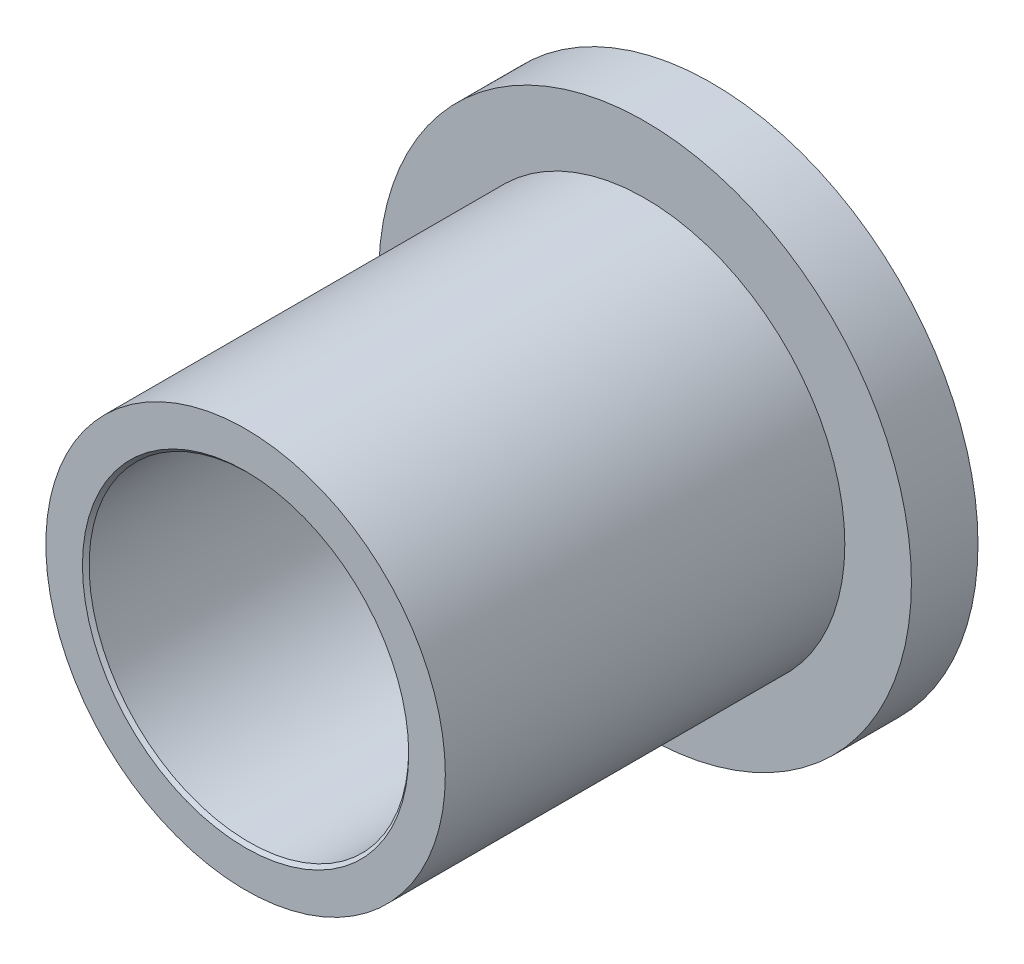
ISO-10303-21;
HEADER;
FILE_DESCRIPTION(('STEP AP214'),'2;1');
FILE_NAME('part.step','',(''),(''),'','','');
FILE_SCHEMA(('AUTOMOTIVE_DESIGN { 1 0 10303 214 1 1 1 1 }'));
ENDSEC;
DATA;
#1=APPLICATION_CONTEXT('core data for automotive mechanical design processes');
#2=APPLICATION_PROTOCOL_DEFINITION('international standard','automotive_design',2000,#1);
#3=PRODUCT_CONTEXT('',#1,'mechanical');
#4=PRODUCT('Part','Part','',(#3));
#5=PRODUCT_RELATED_PRODUCT_CATEGORY('part','',(#4));
#6=PRODUCT_DEFINITION_FORMATION('','',#4);
#7=PRODUCT_DEFINITION_CONTEXT('part definition',#1,'design');
#8=PRODUCT_DEFINITION('design','',#6,#7);
#9=PRODUCT_DEFINITION_SHAPE('','',#8);
#10=(LENGTH_UNIT() NAMED_UNIT(*) SI_UNIT(.MILLI.,.METRE.));
#11=(NAMED_UNIT(*) PLANE_ANGLE_UNIT() SI_UNIT($,.RADIAN.));
#12=(NAMED_UNIT(*) SI_UNIT($,.STERADIAN.) SOLID_ANGLE_UNIT());
#13=UNCERTAINTY_MEASURE_WITH_UNIT(LENGTH_MEASURE(1.E-05),#10,'distance_accuracy_value','');
#14=(GEOMETRIC_REPRESENTATION_CONTEXT(3) GLOBAL_UNCERTAINTY_ASSIGNED_CONTEXT((#13)) GLOBAL_UNIT_ASSIGNED_CONTEXT((#10,
#11,#12)) REPRESENTATION_CONTEXT('',''));
#15=CARTESIAN_POINT('',(0.,0.,0.));
#16=DIRECTION('',(0.,0.,1.));
#17=DIRECTION('',(1.,0.,0.));
#18=AXIS2_PLACEMENT_3D('',#15,#16,#17);
#19=CARTESIAN_POINT('',(0.,0.,0.5));
#20=DIRECTION('',(0.,0.,-1.));
#21=DIRECTION('',(-1.,0.,0.));
#22=AXIS2_PLACEMENT_3D('',#19,#20,#21);
#23=CYLINDRICAL_SURFACE('',#22,2.);
#24=CARTESIAN_POINT('',(0.,0.,0.5));
#25=DIRECTION('',(0.,0.,1.));
#26=DIRECTION('',(1.,0.,0.));
#27=AXIS2_PLACEMENT_3D('',#24,#25,#26);
#28=CIRCLE('',#27,2.);
#29=CARTESIAN_POINT('',(2.,0.,0.5));
#30=VERTEX_POINT('',#29);
#31=EDGE_CURVE('E42',#30,#30,#28,.T.);
#32=ORIENTED_EDGE('',*,*,#31,.F.);
#33=EDGE_LOOP('',(#32));
#34=FACE_BOUND('',#33,.T.);
#35=CARTESIAN_POINT('',(0.,0.,0.));
#36=DIRECTION('',(0.,0.,1.));
#37=DIRECTION('',(1.,0.,0.));
#38=AXIS2_PLACEMENT_3D('',#35,#36,#37);
#39=CIRCLE('',#38,2.);
#40=CARTESIAN_POINT('',(2.,0.,0.));
#41=VERTEX_POINT('',#40);
#42=EDGE_CURVE('E38',#41,#41,#39,.T.);
#43=ORIENTED_EDGE('',*,*,#42,.T.);
#44=EDGE_LOOP('',(#43));
#45=FACE_BOUND('',#44,.T.);
#46=ADVANCED_FACE('F35',(#34,#45),#23,.T.);
#47=CARTESIAN_POINT('',(0.,0.,0.5));
#48=DIRECTION('',(0.,0.,1.));
#49=DIRECTION('',(1.,0.,0.));
#50=AXIS2_PLACEMENT_3D('',#47,#48,#49);
#51=PLANE('',#50);
#52=CARTESIAN_POINT('',(0.,0.,0.5));
#53=DIRECTION('',(0.,0.,1.));
#54=DIRECTION('',(1.,0.,0.));
#55=AXIS2_PLACEMENT_3D('',#52,#53,#54);
#56=CIRCLE('',#55,1.5);
#57=CARTESIAN_POINT('',(1.5,0.,0.5));
#58=VERTEX_POINT('',#57);
#59=EDGE_CURVE('E10',#58,#58,#56,.T.);
#60=ORIENTED_EDGE('',*,*,#59,.F.);
#61=EDGE_LOOP('',(#60));
#62=FACE_BOUND('',#61,.T.);
#63=ORIENTED_EDGE('',*,*,#31,.T.);
#64=EDGE_LOOP('',(#63));
#65=FACE_BOUND('',#64,.T.);
#66=ADVANCED_FACE('F77',(#62,#65),#51,.T.);
#67=CARTESIAN_POINT('',(0.,0.,0.));
#68=DIRECTION('',(0.,0.,1.));
#69=DIRECTION('',(1.,0.,0.));
#70=AXIS2_PLACEMENT_3D('',#67,#68,#69);
#71=PLANE('',#70);
#72=CARTESIAN_POINT('',(0.,0.,0.));
#73=DIRECTION('',(0.,0.,1.));
#74=DIRECTION('',(1.,0.,0.));
#75=AXIS2_PLACEMENT_3D('',#72,#73,#74);
#76=CIRCLE('',#75,1.2);
#77=CARTESIAN_POINT('',(1.2,0.,0.));
#78=VERTEX_POINT('',#77);
#79=EDGE_CURVE('E51',#78,#78,#76,.T.);
#80=ORIENTED_EDGE('',*,*,#79,.T.);
#81=EDGE_LOOP('',(#80));
#82=FACE_BOUND('',#81,.T.);
#83=ORIENTED_EDGE('',*,*,#42,.F.);
#84=EDGE_LOOP('',(#83));
#85=FACE_BOUND('',#84,.T.);
#86=ADVANCED_FACE('F72',(#82,#85),#71,.F.);
#87=CARTESIAN_POINT('',(0.,0.,3.5));
#88=DIRECTION('',(0.,0.,-1.));
#89=DIRECTION('',(-1.,0.,0.));
#90=AXIS2_PLACEMENT_3D('',#87,#88,#89);
#91=CYLINDRICAL_SURFACE('',#90,1.5);
#92=CARTESIAN_POINT('',(0.,0.,3.5));
#93=DIRECTION('',(0.,0.,1.));
#94=DIRECTION('',(1.,0.,0.));
#95=AXIS2_PLACEMENT_3D('',#92,#93,#94);
#96=CIRCLE('',#95,1.5);
#97=CARTESIAN_POINT('',(1.5,0.,3.5));
#98=VERTEX_POINT('',#97);
#99=EDGE_CURVE('E48',#98,#98,#96,.T.);
#100=ORIENTED_EDGE('',*,*,#99,.F.);
#101=EDGE_LOOP('',(#100));
#102=FACE_BOUND('',#101,.T.);
#103=ORIENTED_EDGE('',*,*,#59,.T.);
#104=EDGE_LOOP('',(#103));
#105=FACE_BOUND('',#104,.T.);
#106=ADVANCED_FACE('F67',(#102,#105),#91,.T.);
#107=CARTESIAN_POINT('',(0.,0.,3.5));
#108=DIRECTION('',(0.,0.,1.));
#109=DIRECTION('',(1.,0.,0.));
#110=AXIS2_PLACEMENT_3D('',#107,#108,#109);
#111=PLANE('',#110);
#112=CARTESIAN_POINT('',(0.,0.,3.5));
#113=DIRECTION('',(0.,0.,1.));
#114=DIRECTION('',(1.,0.,0.));
#115=AXIS2_PLACEMENT_3D('',#112,#113,#114);
#116=CIRCLE('',#115,1.225);
#117=CARTESIAN_POINT('',(1.225,0.,3.5));
#118=VERTEX_POINT('',#117);
#119=EDGE_CURVE('E57',#118,#118,#116,.T.);
#120=ORIENTED_EDGE('',*,*,#119,.F.);
#121=EDGE_LOOP('',(#120));
#122=FACE_BOUND('',#121,.T.);
#123=ORIENTED_EDGE('',*,*,#99,.T.);
#124=EDGE_LOOP('',(#123));
#125=FACE_BOUND('',#124,.T.);
#126=ADVANCED_FACE('F63',(#122,#125),#111,.T.);
#127=CARTESIAN_POINT('',(0.,0.,3.5));
#128=DIRECTION('',(0.,0.,1.));
#129=DIRECTION('',(1.,0.,0.));
#130=AXIS2_PLACEMENT_3D('',#127,#128,#129);
#131=CYLINDRICAL_SURFACE('',#130,1.2);
#132=ORIENTED_EDGE('',*,*,#79,.F.);
#133=EDGE_LOOP('',(#132));
#134=FACE_BOUND('',#133,.T.);
#135=CARTESIAN_POINT('',(0.,0.,3.475));
#136=DIRECTION('',(0.,0.,1.));
#137=DIRECTION('',(1.,0.,0.));
#138=AXIS2_PLACEMENT_3D('',#135,#136,#137);
#139=CIRCLE('',#138,1.2);
#140=CARTESIAN_POINT('',(1.2,0.,3.475));
#141=VERTEX_POINT('',#140);
#142=EDGE_CURVE('E54',#141,#141,#139,.T.);
#143=ORIENTED_EDGE('',*,*,#142,.T.);
#144=EDGE_LOOP('',(#143));
#145=FACE_BOUND('',#144,.T.);
#146=ADVANCED_FACE('F66',(#134,#145),#131,.F.);
#147=CARTESIAN_POINT('',(0.,0.,3.5));
#148=DIRECTION('',(0.,0.,1.));
#149=DIRECTION('',(1.,0.,0.));
#150=AXIS2_PLACEMENT_3D('',#147,#148,#149);
#151=CONICAL_SURFACE('',#150,1.225,0.785398163397466);
#152=ORIENTED_EDGE('',*,*,#142,.F.);
#153=EDGE_LOOP('',(#152));
#154=FACE_BOUND('',#153,.T.);
#155=ORIENTED_EDGE('',*,*,#119,.T.);
#156=EDGE_LOOP('',(#155));
#157=FACE_BOUND('',#156,.T.);
#158=ADVANCED_FACE('F61',(#154,#157),#151,.F.);
#159=CLOSED_SHELL('',(#46,#66,#86,#106,#126,#146,#158));
#160=MANIFOLD_SOLID_BREP('B2',#159);
#161=ADVANCED_BREP_SHAPE_REPRESENTATION('',(#18,#160),#14);
#162=SHAPE_DEFINITION_REPRESENTATION(#9,#161);
ENDSEC;
END-ISO-10303-21;
